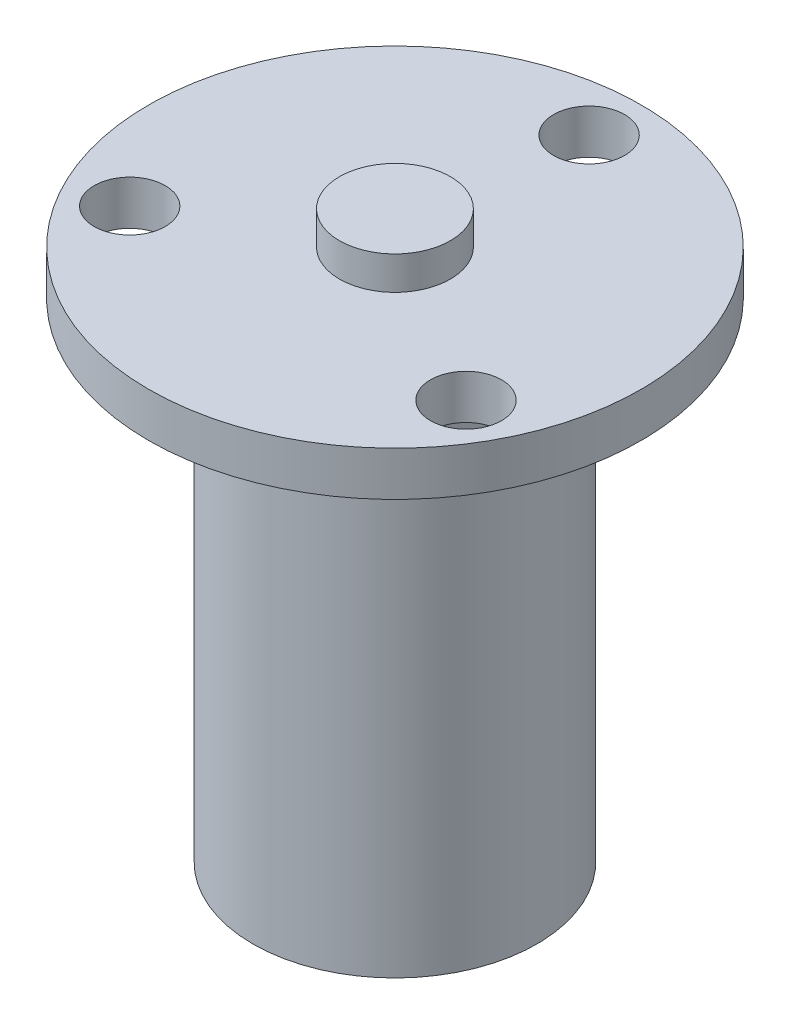
ISO-10303-21;
HEADER;
FILE_DESCRIPTION(('STEP AP214'),'2;1');
FILE_NAME('part.step','',(''),(''),'','','');
FILE_SCHEMA(('AUTOMOTIVE_DESIGN { 1 0 10303 214 1 1 1 1 }'));
ENDSEC;
DATA;
#1=APPLICATION_CONTEXT('core data for automotive mechanical design processes');
#2=APPLICATION_PROTOCOL_DEFINITION('international standard','automotive_design',2000,#1);
#3=PRODUCT_CONTEXT('',#1,'mechanical');
#4=PRODUCT('Part','Part','',(#3));
#5=PRODUCT_RELATED_PRODUCT_CATEGORY('part','',(#4));
#6=PRODUCT_DEFINITION_FORMATION('','',#4);
#7=PRODUCT_DEFINITION_CONTEXT('part definition',#1,'design');
#8=PRODUCT_DEFINITION('design','',#6,#7);
#9=PRODUCT_DEFINITION_SHAPE('','',#8);
#10=(LENGTH_UNIT() NAMED_UNIT(*) SI_UNIT(.MILLI.,.METRE.));
#11=(NAMED_UNIT(*) PLANE_ANGLE_UNIT() SI_UNIT($,.RADIAN.));
#12=(NAMED_UNIT(*) SI_UNIT($,.STERADIAN.) SOLID_ANGLE_UNIT());
#13=UNCERTAINTY_MEASURE_WITH_UNIT(LENGTH_MEASURE(1.E-05),#10,'distance_accuracy_value','');
#14=(GEOMETRIC_REPRESENTATION_CONTEXT(3) GLOBAL_UNCERTAINTY_ASSIGNED_CONTEXT((#13)) GLOBAL_UNIT_ASSIGNED_CONTEXT((#10,
#11,#12)) REPRESENTATION_CONTEXT('',''));
#15=CARTESIAN_POINT('',(0.,0.,0.));
#16=DIRECTION('',(0.,0.,1.));
#17=DIRECTION('',(1.,0.,0.));
#18=AXIS2_PLACEMENT_3D('',#15,#16,#17);
#19=CARTESIAN_POINT('',(0.,22.,0.));
#20=DIRECTION('',(0.,-1.,0.));
#21=DIRECTION('',(0.,0.,-1.));
#22=AXIS2_PLACEMENT_3D('',#19,#20,#21);
#23=CYLINDRICAL_SURFACE('',#22,6.4);
#24=CARTESIAN_POINT('',(0.,22.,0.));
#25=DIRECTION('',(0.,1.,0.));
#26=DIRECTION('',(0.,0.,1.));
#27=AXIS2_PLACEMENT_3D('',#24,#25,#26);
#28=CIRCLE('',#27,6.4);
#29=CARTESIAN_POINT('',(0.,22.,6.4));
#30=VERTEX_POINT('',#29);
#31=EDGE_CURVE('E10',#30,#30,#28,.T.);
#32=ORIENTED_EDGE('',*,*,#31,.F.);
#33=EDGE_LOOP('',(#32));
#34=FACE_BOUND('',#33,.T.);
#35=CARTESIAN_POINT('',(0.,0.,0.));
#36=DIRECTION('',(0.,1.,0.));
#37=DIRECTION('',(0.,0.,1.));
#38=AXIS2_PLACEMENT_3D('',#35,#36,#37);
#39=CIRCLE('',#38,6.4);
#40=CARTESIAN_POINT('',(0.,0.,6.4));
#41=VERTEX_POINT('',#40);
#42=EDGE_CURVE('E40',#41,#41,#39,.T.);
#43=ORIENTED_EDGE('',*,*,#42,.T.);
#44=EDGE_LOOP('',(#43));
#45=FACE_BOUND('',#44,.T.);
#46=ADVANCED_FACE('F37',(#34,#45),#23,.T.);
#47=CARTESIAN_POINT('',(0.,0.,0.));
#48=DIRECTION('',(0.,1.,0.));
#49=DIRECTION('',(0.,0.,1.));
#50=AXIS2_PLACEMENT_3D('',#47,#48,#49);
#51=PLANE('',#50);
#52=ORIENTED_EDGE('',*,*,#42,.F.);
#53=EDGE_LOOP('',(#52));
#54=FACE_BOUND('',#53,.T.);
#55=ADVANCED_FACE('F104',(#54),#51,.F.);
#56=CARTESIAN_POINT('',(0.,24.,0.));
#57=DIRECTION('',(0.,1.,0.));
#58=DIRECTION('',(0.,0.,1.));
#59=AXIS2_PLACEMENT_3D('',#56,#57,#58);
#60=PLANE('',#59);
#61=CARTESIAN_POINT('',(0.,24.,0.));
#62=DIRECTION('',(0.,1.,0.));
#63=DIRECTION('',(0.,0.,1.));
#64=AXIS2_PLACEMENT_3D('',#61,#62,#63);
#65=CIRCLE('',#64,2.5);
#66=CARTESIAN_POINT('',(0.,24.,2.5));
#67=VERTEX_POINT('',#66);
#68=EDGE_CURVE('E83',#67,#67,#65,.T.);
#69=ORIENTED_EDGE('',*,*,#68,.F.);
#70=EDGE_LOOP('',(#69));
#71=FACE_BOUND('',#70,.T.);
#72=CARTESIAN_POINT('',(7.5777222831144,24.,4.37499999999967));
#73=DIRECTION('',(0.,1.,0.));
#74=DIRECTION('',(0.,0.,1.));
#75=AXIS2_PLACEMENT_3D('',#72,#73,#74);
#76=CIRCLE('',#75,1.60000000000049);
#77=CARTESIAN_POINT('',(7.5777222831144,24.,5.97500000000016));
#78=VERTEX_POINT('',#77);
#79=EDGE_CURVE('E63',#78,#78,#76,.T.);
#80=ORIENTED_EDGE('',*,*,#79,.F.);
#81=EDGE_LOOP('',(#80));
#82=FACE_BOUND('',#81,.T.);
#83=CARTESIAN_POINT('',(0.,24.,0.));
#84=DIRECTION('',(0.,1.,0.));
#85=DIRECTION('',(0.,0.,1.));
#86=AXIS2_PLACEMENT_3D('',#83,#84,#85);
#87=CIRCLE('',#86,11.1);
#88=CARTESIAN_POINT('',(0.,24.,11.1));
#89=VERTEX_POINT('',#88);
#90=EDGE_CURVE('E49',#89,#89,#87,.T.);
#91=ORIENTED_EDGE('',*,*,#90,.T.);
#92=EDGE_LOOP('',(#91));
#93=FACE_BOUND('',#92,.T.);
#94=CARTESIAN_POINT('',(0.,24.,-8.75));
#95=DIRECTION('',(0.,1.,0.));
#96=DIRECTION('',(0.,0.,1.));
#97=AXIS2_PLACEMENT_3D('',#94,#95,#96);
#98=CIRCLE('',#97,1.6);
#99=CARTESIAN_POINT('',(0.,24.,-7.15));
#100=VERTEX_POINT('',#99);
#101=EDGE_CURVE('E55',#100,#100,#98,.T.);
#102=ORIENTED_EDGE('',*,*,#101,.F.);
#103=EDGE_LOOP('',(#102));
#104=FACE_BOUND('',#103,.T.);
#105=CARTESIAN_POINT('',(-7.57772228311328,24.,4.37500000000033));
#106=DIRECTION('',(0.,1.,0.));
#107=DIRECTION('',(0.,0.,1.));
#108=AXIS2_PLACEMENT_3D('',#105,#106,#107);
#109=CIRCLE('',#108,1.60000000000071);
#110=CARTESIAN_POINT('',(-7.57772228311328,24.,5.97500000000103));
#111=VERTEX_POINT('',#110);
#112=EDGE_CURVE('E71',#111,#111,#109,.T.);
#113=ORIENTED_EDGE('',*,*,#112,.F.);
#114=EDGE_LOOP('',(#113));
#115=FACE_BOUND('',#114,.T.);
#116=ADVANCED_FACE('F100',(#71,#82,#93,#104,#115),#60,.T.);
#117=CARTESIAN_POINT('',(0.,22.,0.));
#118=DIRECTION('',(0.,1.,0.));
#119=DIRECTION('',(0.,0.,1.));
#120=AXIS2_PLACEMENT_3D('',#117,#118,#119);
#121=PLANE('',#120);
#122=ORIENTED_EDGE('',*,*,#31,.T.);
#123=EDGE_LOOP('',(#122));
#124=FACE_BOUND('',#123,.T.);
#125=CARTESIAN_POINT('',(0.,22.,0.));
#126=DIRECTION('',(0.,1.,0.));
#127=DIRECTION('',(0.,0.,1.));
#128=AXIS2_PLACEMENT_3D('',#125,#126,#127);
#129=CIRCLE('',#128,11.1);
#130=CARTESIAN_POINT('',(0.,22.,11.1));
#131=VERTEX_POINT('',#130);
#132=EDGE_CURVE('E51',#131,#131,#129,.T.);
#133=ORIENTED_EDGE('',*,*,#132,.F.);
#134=EDGE_LOOP('',(#133));
#135=FACE_BOUND('',#134,.T.);
#136=CARTESIAN_POINT('',(0.,22.,-8.75));
#137=DIRECTION('',(0.,1.,0.));
#138=DIRECTION('',(0.,0.,1.));
#139=AXIS2_PLACEMENT_3D('',#136,#137,#138);
#140=CIRCLE('',#139,1.6);
#141=CARTESIAN_POINT('',(0.,22.,-7.15));
#142=VERTEX_POINT('',#141);
#143=EDGE_CURVE('E59',#142,#142,#140,.T.);
#144=ORIENTED_EDGE('',*,*,#143,.T.);
#145=EDGE_LOOP('',(#144));
#146=FACE_BOUND('',#145,.T.);
#147=CARTESIAN_POINT('',(7.5777222831144,22.,4.37499999999967));
#148=DIRECTION('',(0.,1.,0.));
#149=DIRECTION('',(0.,0.,1.));
#150=AXIS2_PLACEMENT_3D('',#147,#148,#149);
#151=CIRCLE('',#150,1.60000000000049);
#152=CARTESIAN_POINT('',(7.5777222831144,22.,5.97500000000016));
#153=VERTEX_POINT('',#152);
#154=EDGE_CURVE('E67',#153,#153,#151,.T.);
#155=ORIENTED_EDGE('',*,*,#154,.T.);
#156=EDGE_LOOP('',(#155));
#157=FACE_BOUND('',#156,.T.);
#158=CARTESIAN_POINT('',(-7.57772228311328,22.,4.37500000000033));
#159=DIRECTION('',(0.,1.,0.));
#160=DIRECTION('',(0.,0.,1.));
#161=AXIS2_PLACEMENT_3D('',#158,#159,#160);
#162=CIRCLE('',#161,1.60000000000071);
#163=CARTESIAN_POINT('',(-7.57772228311328,22.,5.97500000000103));
#164=VERTEX_POINT('',#163);
#165=EDGE_CURVE('E75',#164,#164,#162,.T.);
#166=ORIENTED_EDGE('',*,*,#165,.T.);
#167=EDGE_LOOP('',(#166));
#168=FACE_BOUND('',#167,.T.);
#169=ADVANCED_FACE('F103',(#124,#135,#146,#157,#168),#121,.F.);
#170=CARTESIAN_POINT('',(0.,24.,0.));
#171=DIRECTION('',(0.,-1.,0.));
#172=DIRECTION('',(0.,0.,-1.));
#173=AXIS2_PLACEMENT_3D('',#170,#171,#172);
#174=CYLINDRICAL_SURFACE('',#173,11.1);
#175=ORIENTED_EDGE('',*,*,#90,.F.);
#176=EDGE_LOOP('',(#175));
#177=FACE_BOUND('',#176,.T.);
#178=ORIENTED_EDGE('',*,*,#132,.T.);
#179=EDGE_LOOP('',(#178));
#180=FACE_BOUND('',#179,.T.);
#181=ADVANCED_FACE('F121',(#177,#180),#174,.T.);
#182=CARTESIAN_POINT('',(0.,24.,-8.75));
#183=DIRECTION('',(0.,-1.,0.));
#184=DIRECTION('',(0.,0.,-1.));
#185=AXIS2_PLACEMENT_3D('',#182,#183,#184);
#186=CYLINDRICAL_SURFACE('',#185,1.6);
#187=ORIENTED_EDGE('',*,*,#101,.T.);
#188=EDGE_LOOP('',(#187));
#189=FACE_BOUND('',#188,.T.);
#190=ORIENTED_EDGE('',*,*,#143,.F.);
#191=EDGE_LOOP('',(#190));
#192=FACE_BOUND('',#191,.T.);
#193=ADVANCED_FACE('F126',(#189,#192),#186,.F.);
#194=CARTESIAN_POINT('',(7.5777222831144,24.,4.37499999999967));
#195=DIRECTION('',(0.,-1.,0.));
#196=DIRECTION('',(0.,0.,-1.));
#197=AXIS2_PLACEMENT_3D('',#194,#195,#196);
#198=CYLINDRICAL_SURFACE('',#197,1.60000000000049);
#199=ORIENTED_EDGE('',*,*,#79,.T.);
#200=EDGE_LOOP('',(#199));
#201=FACE_BOUND('',#200,.T.);
#202=ORIENTED_EDGE('',*,*,#154,.F.);
#203=EDGE_LOOP('',(#202));
#204=FACE_BOUND('',#203,.T.);
#205=ADVANCED_FACE('F116',(#201,#204),#198,.F.);
#206=CARTESIAN_POINT('',(-7.57772228311328,24.,4.37500000000033));
#207=DIRECTION('',(0.,-1.,0.));
#208=DIRECTION('',(0.,0.,-1.));
#209=AXIS2_PLACEMENT_3D('',#206,#207,#208);
#210=CYLINDRICAL_SURFACE('',#209,1.60000000000071);
#211=ORIENTED_EDGE('',*,*,#112,.T.);
#212=EDGE_LOOP('',(#211));
#213=FACE_BOUND('',#212,.T.);
#214=ORIENTED_EDGE('',*,*,#165,.F.);
#215=EDGE_LOOP('',(#214));
#216=FACE_BOUND('',#215,.T.);
#217=ADVANCED_FACE('F96',(#213,#216),#210,.F.);
#218=CARTESIAN_POINT('',(0.,25.5,0.));
#219=DIRECTION('',(0.,-1.,0.));
#220=DIRECTION('',(0.,0.,-1.));
#221=AXIS2_PLACEMENT_3D('',#218,#219,#220);
#222=CYLINDRICAL_SURFACE('',#221,2.5);
#223=CARTESIAN_POINT('',(0.,25.5,0.));
#224=DIRECTION('',(0.,1.,0.));
#225=DIRECTION('',(0.,0.,1.));
#226=AXIS2_PLACEMENT_3D('',#223,#224,#225);
#227=CIRCLE('',#226,2.5);
#228=CARTESIAN_POINT('',(0.,25.5,2.5));
#229=VERTEX_POINT('',#228);
#230=EDGE_CURVE('E79',#229,#229,#227,.T.);
#231=ORIENTED_EDGE('',*,*,#230,.F.);
#232=EDGE_LOOP('',(#231));
#233=FACE_BOUND('',#232,.T.);
#234=ORIENTED_EDGE('',*,*,#68,.T.);
#235=EDGE_LOOP('',(#234));
#236=FACE_BOUND('',#235,.T.);
#237=ADVANCED_FACE('F93',(#233,#236),#222,.T.);
#238=CARTESIAN_POINT('',(0.,25.5,0.));
#239=DIRECTION('',(0.,1.,0.));
#240=DIRECTION('',(0.,0.,1.));
#241=AXIS2_PLACEMENT_3D('',#238,#239,#240);
#242=PLANE('',#241);
#243=ORIENTED_EDGE('',*,*,#230,.T.);
#244=EDGE_LOOP('',(#243));
#245=FACE_BOUND('',#244,.T.);
#246=ADVANCED_FACE('F91',(#245),#242,.T.);
#247=CLOSED_SHELL('',(#46,#55,#116,#169,#181,#193,#205,#217,#237,#246));
#248=MANIFOLD_SOLID_BREP('B2',#247);
#249=ADVANCED_BREP_SHAPE_REPRESENTATION('',(#18,#248),#14);
#250=SHAPE_DEFINITION_REPRESENTATION(#9,#249);
ENDSEC;
END-ISO-10303-21;
